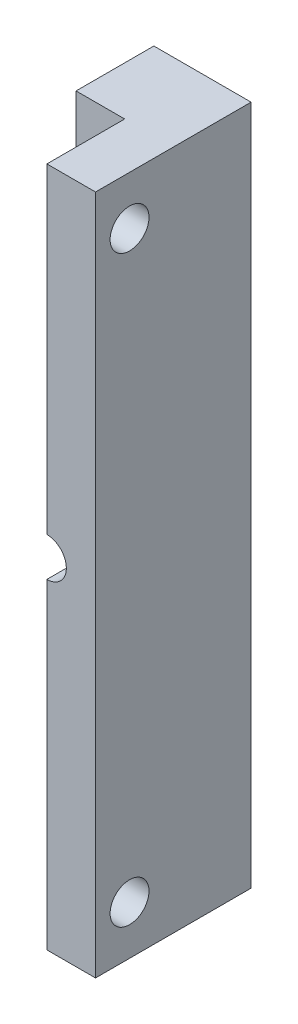
ISO-10303-21;
HEADER;
FILE_DESCRIPTION(('STEP AP214'),'2;1');
FILE_NAME('part.step','',(''),(''),'','','');
FILE_SCHEMA(('AUTOMOTIVE_DESIGN { 1 0 10303 214 1 1 1 1 }'));
ENDSEC;
DATA;
#1=APPLICATION_CONTEXT('core data for automotive mechanical design processes');
#2=APPLICATION_PROTOCOL_DEFINITION('international standard','automotive_design',2000,#1);
#3=PRODUCT_CONTEXT('',#1,'mechanical');
#4=PRODUCT('Part','Part','',(#3));
#5=PRODUCT_RELATED_PRODUCT_CATEGORY('part','',(#4));
#6=PRODUCT_DEFINITION_FORMATION('','',#4);
#7=PRODUCT_DEFINITION_CONTEXT('part definition',#1,'design');
#8=PRODUCT_DEFINITION('design','',#6,#7);
#9=PRODUCT_DEFINITION_SHAPE('','',#8);
#10=(LENGTH_UNIT() NAMED_UNIT(*) SI_UNIT(.MILLI.,.METRE.));
#11=(NAMED_UNIT(*) PLANE_ANGLE_UNIT() SI_UNIT($,.RADIAN.));
#12=(NAMED_UNIT(*) SI_UNIT($,.STERADIAN.) SOLID_ANGLE_UNIT());
#13=UNCERTAINTY_MEASURE_WITH_UNIT(LENGTH_MEASURE(1.E-05),#10,'distance_accuracy_value','');
#14=(GEOMETRIC_REPRESENTATION_CONTEXT(3) GLOBAL_UNCERTAINTY_ASSIGNED_CONTEXT((#13)) GLOBAL_UNIT_ASSIGNED_CONTEXT((#10,
#11,#12)) REPRESENTATION_CONTEXT('',''));
#15=CARTESIAN_POINT('',(0.,0.,0.));
#16=DIRECTION('',(0.,0.,1.));
#17=DIRECTION('',(1.,0.,0.));
#18=AXIS2_PLACEMENT_3D('',#15,#16,#17);
#19=CARTESIAN_POINT('',(0.,70.,0.));
#20=DIRECTION('',(1.,0.,0.));
#21=DIRECTION('',(0.,0.,-1.));
#22=AXIS2_PLACEMENT_3D('',#19,#20,#21);
#23=PLANE('',#22);
#24=CARTESIAN_POINT('',(0.,60.,29.));
#25=DIRECTION('',(1.,0.,0.));
#26=DIRECTION('',(0.,0.,-1.));
#27=AXIS2_PLACEMENT_3D('',#24,#25,#26);
#28=CIRCLE('',#27,4.);
#29=CARTESIAN_POINT('',(0.,60.,25.));
#30=VERTEX_POINT('',#29);
#31=EDGE_CURVE('E72',#30,#30,#28,.F.);
#32=ORIENTED_EDGE('',*,*,#31,.F.);
#33=EDGE_LOOP('',(#32));
#34=FACE_BOUND('',#33,.T.);
#35=DIRECTION('',(0.,-1.,0.));
#36=VECTOR('',#35,1.);
#37=CARTESIAN_POINT('',(0.,70.,20.));
#38=LINE('',#37,#36);
#39=CARTESIAN_POINT('',(0.,70.,20.));
#40=VERTEX_POINT('',#39);
#41=CARTESIAN_POINT('',(0.,4.,20.));
#42=VERTEX_POINT('',#41);
#43=EDGE_CURVE('E332',#40,#42,#38,.T.);
#44=ORIENTED_EDGE('',*,*,#43,.T.);
#45=DIRECTION('',(0.,0.,1.));
#46=VECTOR('',#45,1.);
#47=CARTESIAN_POINT('',(0.,4.,16.));
#48=LINE('',#47,#46);
#49=CARTESIAN_POINT('',(0.,4.,36.));
#50=VERTEX_POINT('',#49);
#51=EDGE_CURVE('E86',#42,#50,#48,.T.);
#52=ORIENTED_EDGE('',*,*,#51,.T.);
#53=DIRECTION('',(0.,-1.,0.));
#54=VECTOR('',#53,1.);
#55=CARTESIAN_POINT('',(0.,70.,36.));
#56=LINE('',#55,#54);
#57=CARTESIAN_POINT('',(0.,70.,36.));
#58=VERTEX_POINT('',#57);
#59=EDGE_CURVE('E337',#58,#50,#56,.T.);
#60=ORIENTED_EDGE('',*,*,#59,.F.);
#61=DIRECTION('',(0.,0.,1.));
#62=VECTOR('',#61,1.);
#63=CARTESIAN_POINT('',(0.,70.,0.));
#64=LINE('',#63,#62);
#65=EDGE_CURVE('E353',#40,#58,#64,.T.);
#66=ORIENTED_EDGE('',*,*,#65,.F.);
#67=EDGE_LOOP('',(#44,#52,#60,#66));
#68=FACE_BOUND('',#67,.T.);
#69=ADVANCED_FACE('F68',(#34,#68),#23,.F.);
#70=CARTESIAN_POINT('',(0.,0.,0.));
#71=DIRECTION('',(0.,0.,1.));
#72=DIRECTION('',(1.,0.,0.));
#73=AXIS2_PLACEMENT_3D('',#70,#71,#72);
#74=PLANE('',#73);
#75=DIRECTION('',(0.,1.,0.));
#76=VECTOR('',#75,1.);
#77=CARTESIAN_POINT('',(-3.1,-22.,0.));
#78=LINE('',#77,#76);
#79=CARTESIAN_POINT('',(-3.1,3.1,0.));
#80=VERTEX_POINT('',#79);
#81=CARTESIAN_POINT('',(-3.1,48.,0.));
#82=VERTEX_POINT('',#81);
#83=EDGE_CURVE('E223',#80,#82,#78,.T.);
#84=ORIENTED_EDGE('',*,*,#83,.T.);
#85=DIRECTION('',(-1.,0.,0.));
#86=VECTOR('',#85,1.);
#87=CARTESIAN_POINT('',(3.1,48.,0.));
#88=LINE('',#87,#86);
#89=CARTESIAN_POINT('',(3.1,48.,0.));
#90=VERTEX_POINT('',#89);
#91=EDGE_CURVE('E190',#90,#82,#88,.T.);
#92=ORIENTED_EDGE('',*,*,#91,.F.);
#93=DIRECTION('',(0.,1.,0.));
#94=VECTOR('',#93,1.);
#95=CARTESIAN_POINT('',(3.1,-22.,0.));
#96=LINE('',#95,#94);
#97=CARTESIAN_POINT('',(3.1,3.1,0.));
#98=VERTEX_POINT('',#97);
#99=EDGE_CURVE('E230',#98,#90,#96,.T.);
#100=ORIENTED_EDGE('',*,*,#99,.F.);
#101=DIRECTION('',(1.,0.,0.));
#102=VECTOR('',#101,1.);
#103=CARTESIAN_POINT('',(-3.1,3.1,0.));
#104=LINE('',#103,#102);
#105=EDGE_CURVE('E271',#80,#98,#104,.T.);
#106=ORIENTED_EDGE('',*,*,#105,.F.);
#107=EDGE_LOOP('',(#84,#92,#100,#106));
#108=FACE_BOUND('',#107,.T.);
#109=ADVANCED_FACE('F397',(#108),#74,.F.);
#110=CARTESIAN_POINT('',(3.1,-22.,0.));
#111=DIRECTION('',(1.,0.,0.));
#112=DIRECTION('',(0.,0.,-1.));
#113=AXIS2_PLACEMENT_3D('',#110,#111,#112);
#114=PLANE('',#113);
#115=DIRECTION('',(0.,0.,-1.));
#116=VECTOR('',#115,1.);
#117=CARTESIAN_POINT('',(3.1,48.,4.));
#118=LINE('',#117,#116);
#119=CARTESIAN_POINT('',(3.1,48.,4.));
#120=VERTEX_POINT('',#119);
#121=EDGE_CURVE('E196',#120,#90,#118,.T.);
#122=ORIENTED_EDGE('',*,*,#121,.F.);
#123=DIRECTION('',(0.,1.,0.));
#124=VECTOR('',#123,1.);
#125=CARTESIAN_POINT('',(3.1,-22.,4.));
#126=LINE('',#125,#124);
#127=CARTESIAN_POINT('',(3.1,3.1,4.));
#128=VERTEX_POINT('',#127);
#129=EDGE_CURVE('E205',#128,#120,#126,.T.);
#130=ORIENTED_EDGE('',*,*,#129,.F.);
#131=DIRECTION('',(0.,0.,-1.));
#132=VECTOR('',#131,1.);
#133=CARTESIAN_POINT('',(3.1,3.1,4.));
#134=LINE('',#133,#132);
#135=EDGE_CURVE('E218',#128,#98,#134,.T.);
#136=ORIENTED_EDGE('',*,*,#135,.T.);
#137=ORIENTED_EDGE('',*,*,#99,.T.);
#138=EDGE_LOOP('',(#122,#130,#136,#137));
#139=FACE_BOUND('',#138,.T.);
#140=ADVANCED_FACE('F448',(#139),#114,.T.);
#141=CARTESIAN_POINT('',(-3.1,-22.,0.));
#142=DIRECTION('',(-1.,0.,0.));
#143=DIRECTION('',(0.,0.,1.));
#144=AXIS2_PLACEMENT_3D('',#141,#142,#143);
#145=PLANE('',#144);
#146=DIRECTION('',(0.,0.,-1.));
#147=VECTOR('',#146,1.);
#148=CARTESIAN_POINT('',(-3.1,48.,4.));
#149=LINE('',#148,#147);
#150=CARTESIAN_POINT('',(-3.1,48.,4.));
#151=VERTEX_POINT('',#150);
#152=EDGE_CURVE('E184',#151,#82,#149,.T.);
#153=ORIENTED_EDGE('',*,*,#152,.T.);
#154=ORIENTED_EDGE('',*,*,#83,.F.);
#155=DIRECTION('',(0.,0.,-1.));
#156=VECTOR('',#155,1.);
#157=CARTESIAN_POINT('',(-3.1,3.1,4.));
#158=LINE('',#157,#156);
#159=CARTESIAN_POINT('',(-3.1,3.1,4.));
#160=VERTEX_POINT('',#159);
#161=EDGE_CURVE('E210',#160,#80,#158,.T.);
#162=ORIENTED_EDGE('',*,*,#161,.F.);
#163=DIRECTION('',(0.,1.,0.));
#164=VECTOR('',#163,1.);
#165=CARTESIAN_POINT('',(-3.1,-22.,4.));
#166=LINE('',#165,#164);
#167=EDGE_CURVE('E78',#160,#151,#166,.T.);
#168=ORIENTED_EDGE('',*,*,#167,.T.);
#169=EDGE_LOOP('',(#153,#154,#162,#168));
#170=FACE_BOUND('',#169,.T.);
#171=ADVANCED_FACE('F209',(#170),#145,.T.);
#172=CARTESIAN_POINT('',(3.1,-48.,0.));
#173=VERTEX_POINT('',#172);
#174=CARTESIAN_POINT('',(3.1,-3.1,0.));
#175=VERTEX_POINT('',#174);
#176=EDGE_CURVE('E228',#173,#175,#96,.T.);
#177=ORIENTED_EDGE('',*,*,#176,.F.);
#178=DIRECTION('',(1.,0.,0.));
#179=VECTOR('',#178,1.);
#180=CARTESIAN_POINT('',(-3.09999999999999,-48.,0.));
#181=LINE('',#180,#179);
#182=CARTESIAN_POINT('',(-3.09999999999999,-48.,0.));
#183=VERTEX_POINT('',#182);
#184=EDGE_CURVE('E373',#183,#173,#181,.T.);
#185=ORIENTED_EDGE('',*,*,#184,.F.);
#186=CARTESIAN_POINT('',(-3.1,-3.1,0.));
#187=VERTEX_POINT('',#186);
#188=EDGE_CURVE('E215',#183,#187,#78,.T.);
#189=ORIENTED_EDGE('',*,*,#188,.T.);
#190=DIRECTION('',(-1.,0.,0.));
#191=VECTOR('',#190,1.);
#192=CARTESIAN_POINT('',(3.1,-3.1,0.));
#193=LINE('',#192,#191);
#194=EDGE_CURVE('E250',#175,#187,#193,.T.);
#195=ORIENTED_EDGE('',*,*,#194,.F.);
#196=EDGE_LOOP('',(#177,#185,#189,#195));
#197=FACE_BOUND('',#196,.T.);
#198=ADVANCED_FACE('F70',(#197),#74,.F.);
#199=DIRECTION('',(0.,0.,-1.));
#200=VECTOR('',#199,1.);
#201=CARTESIAN_POINT('',(3.1,-48.,4.));
#202=LINE('',#201,#200);
#203=CARTESIAN_POINT('',(3.1,-48.,4.));
#204=VERTEX_POINT('',#203);
#205=EDGE_CURVE('E374',#204,#173,#202,.T.);
#206=ORIENTED_EDGE('',*,*,#205,.T.);
#207=ORIENTED_EDGE('',*,*,#176,.T.);
#208=DIRECTION('',(0.,0.,-1.));
#209=VECTOR('',#208,1.);
#210=CARTESIAN_POINT('',(3.1,-3.1,4.));
#211=LINE('',#210,#209);
#212=CARTESIAN_POINT('',(3.1,-3.1,4.));
#213=VERTEX_POINT('',#212);
#214=EDGE_CURVE('E247',#213,#175,#211,.T.);
#215=ORIENTED_EDGE('',*,*,#214,.F.);
#216=EDGE_CURVE('E231',#204,#213,#126,.T.);
#217=ORIENTED_EDGE('',*,*,#216,.F.);
#218=EDGE_LOOP('',(#206,#207,#215,#217));
#219=FACE_BOUND('',#218,.T.);
#220=ADVANCED_FACE('F442',(#219),#114,.T.);
#221=DIRECTION('',(0.,0.,-1.));
#222=VECTOR('',#221,1.);
#223=CARTESIAN_POINT('',(-3.09999999999999,-48.,4.));
#224=LINE('',#223,#222);
#225=CARTESIAN_POINT('',(-3.09999999999999,-48.,4.));
#226=VERTEX_POINT('',#225);
#227=EDGE_CURVE('E377',#226,#183,#224,.T.);
#228=ORIENTED_EDGE('',*,*,#227,.F.);
#229=CARTESIAN_POINT('',(-3.1,-3.1,4.));
#230=VERTEX_POINT('',#229);
#231=EDGE_CURVE('E12',#226,#230,#166,.T.);
#232=ORIENTED_EDGE('',*,*,#231,.T.);
#233=DIRECTION('',(0.,0.,-1.));
#234=VECTOR('',#233,1.);
#235=CARTESIAN_POINT('',(-3.1,-3.1,4.));
#236=LINE('',#235,#234);
#237=EDGE_CURVE('E241',#230,#187,#236,.T.);
#238=ORIENTED_EDGE('',*,*,#237,.T.);
#239=ORIENTED_EDGE('',*,*,#188,.F.);
#240=EDGE_LOOP('',(#228,#232,#238,#239));
#241=FACE_BOUND('',#240,.T.);
#242=ADVANCED_FACE('F432',(#241),#145,.T.);
#243=CARTESIAN_POINT('',(0.,-22.,4.));
#244=DIRECTION('',(0.,0.,-1.));
#245=DIRECTION('',(-1.,0.,0.));
#246=AXIS2_PLACEMENT_3D('',#243,#244,#245);
#247=PLANE('',#246);
#248=ORIENTED_EDGE('',*,*,#129,.T.);
#249=DIRECTION('',(-1.,0.,0.));
#250=VECTOR('',#249,1.);
#251=CARTESIAN_POINT('',(3.1,48.,4.));
#252=LINE('',#251,#250);
#253=EDGE_CURVE('E187',#120,#151,#252,.T.);
#254=ORIENTED_EDGE('',*,*,#253,.T.);
#255=ORIENTED_EDGE('',*,*,#167,.F.);
#256=DIRECTION('',(1.,0.,0.));
#257=VECTOR('',#256,1.);
#258=CARTESIAN_POINT('',(-3.1,3.1,4.));
#259=LINE('',#258,#257);
#260=EDGE_CURVE('E264',#160,#128,#259,.T.);
#261=ORIENTED_EDGE('',*,*,#260,.T.);
#262=EDGE_LOOP('',(#248,#254,#255,#261));
#263=FACE_BOUND('',#262,.T.);
#264=ORIENTED_EDGE('',*,*,#231,.F.);
#265=DIRECTION('',(1.,0.,0.));
#266=VECTOR('',#265,1.);
#267=CARTESIAN_POINT('',(-3.09999999999999,-48.,4.));
#268=LINE('',#267,#266);
#269=EDGE_CURVE('E370',#226,#204,#268,.T.);
#270=ORIENTED_EDGE('',*,*,#269,.T.);
#271=ORIENTED_EDGE('',*,*,#216,.T.);
#272=DIRECTION('',(-1.,0.,0.));
#273=VECTOR('',#272,1.);
#274=CARTESIAN_POINT('',(3.1,-3.1,4.));
#275=LINE('',#274,#273);
#276=EDGE_CURVE('E260',#213,#230,#275,.T.);
#277=ORIENTED_EDGE('',*,*,#276,.T.);
#278=EDGE_LOOP('',(#264,#270,#271,#277));
#279=FACE_BOUND('',#278,.T.);
#280=CARTESIAN_POINT('',(0.,0.,4.));
#281=DIRECTION('',(0.,0.,1.));
#282=DIRECTION('',(1.,0.,0.));
#283=AXIS2_PLACEMENT_3D('',#280,#281,#282);
#284=CIRCLE('',#283,2.6);
#285=CARTESIAN_POINT('',(2.6,0.,4.));
#286=VERTEX_POINT('',#285);
#287=EDGE_CURVE('E277',#286,#286,#284,.T.);
#288=ORIENTED_EDGE('',*,*,#287,.T.);
#289=EDGE_LOOP('',(#288));
#290=FACE_BOUND('',#289,.T.);
#291=DIRECTION('',(0.,1.,0.));
#292=VECTOR('',#291,1.);
#293=CARTESIAN_POINT('',(-10.,-22.,4.));
#294=LINE('',#293,#292);
#295=CARTESIAN_POINT('',(-10.,-70.,4.));
#296=VERTEX_POINT('',#295);
#297=CARTESIAN_POINT('',(-10.,70.,4.));
#298=VERTEX_POINT('',#297);
#299=EDGE_CURVE('E212',#296,#298,#294,.T.);
#300=ORIENTED_EDGE('',*,*,#299,.T.);
#301=DIRECTION('',(1.,0.,0.));
#302=VECTOR('',#301,1.);
#303=CARTESIAN_POINT('',(-10.,70.,4.));
#304=LINE('',#303,#302);
#305=CARTESIAN_POINT('',(10.,70.,4.));
#306=VERTEX_POINT('',#305);
#307=EDGE_CURVE('E295',#298,#306,#304,.T.);
#308=ORIENTED_EDGE('',*,*,#307,.T.);
#309=DIRECTION('',(0.,1.,0.));
#310=VECTOR('',#309,1.);
#311=CARTESIAN_POINT('',(10.,-22.,4.));
#312=LINE('',#311,#310);
#313=CARTESIAN_POINT('',(10.,-70.,4.));
#314=VERTEX_POINT('',#313);
#315=EDGE_CURVE('E224',#314,#306,#312,.T.);
#316=ORIENTED_EDGE('',*,*,#315,.F.);
#317=DIRECTION('',(-1.,0.,0.));
#318=VECTOR('',#317,1.);
#319=CARTESIAN_POINT('',(-3.09999999999999,-70.,4.));
#320=LINE('',#319,#318);
#321=EDGE_CURVE('E306',#314,#296,#320,.T.);
#322=ORIENTED_EDGE('',*,*,#321,.T.);
#323=EDGE_LOOP('',(#300,#308,#316,#322));
#324=FACE_BOUND('',#323,.T.);
#325=ADVANCED_FACE('F201',(#263,#279,#290,#324),#247,.T.);
#326=CARTESIAN_POINT('',(-3.1,3.1,4.));
#327=DIRECTION('',(0.,1.,0.));
#328=DIRECTION('',(0.,0.,1.));
#329=AXIS2_PLACEMENT_3D('',#326,#327,#328);
#330=PLANE('',#329);
#331=ORIENTED_EDGE('',*,*,#105,.T.);
#332=ORIENTED_EDGE('',*,*,#135,.F.);
#333=ORIENTED_EDGE('',*,*,#260,.F.);
#334=ORIENTED_EDGE('',*,*,#161,.T.);
#335=EDGE_LOOP('',(#331,#332,#333,#334));
#336=FACE_BOUND('',#335,.T.);
#337=ADVANCED_FACE('F431',(#336),#330,.F.);
#338=CARTESIAN_POINT('',(3.1,-3.1,4.));
#339=DIRECTION('',(0.,-1.,0.));
#340=DIRECTION('',(1.,0.,0.));
#341=AXIS2_PLACEMENT_3D('',#338,#339,#340);
#342=PLANE('',#341);
#343=ORIENTED_EDGE('',*,*,#194,.T.);
#344=ORIENTED_EDGE('',*,*,#237,.F.);
#345=ORIENTED_EDGE('',*,*,#276,.F.);
#346=ORIENTED_EDGE('',*,*,#214,.T.);
#347=EDGE_LOOP('',(#343,#344,#345,#346));
#348=FACE_BOUND('',#347,.T.);
#349=ADVANCED_FACE('F439',(#348),#342,.F.);
#350=CARTESIAN_POINT('',(0.,0.,9.));
#351=DIRECTION('',(0.,0.,1.));
#352=DIRECTION('',(1.,0.,0.));
#353=AXIS2_PLACEMENT_3D('',#350,#351,#352);
#354=CYLINDRICAL_SURFACE('',#353,4.);
#355=CARTESIAN_POINT('',(0.,0.,20.));
#356=DIRECTION('',(0.,0.,1.));
#357=DIRECTION('',(1.,0.,0.));
#358=AXIS2_PLACEMENT_3D('',#355,#356,#357);
#359=CIRCLE('',#358,4.);
#360=CARTESIAN_POINT('',(0.,-4.00000000000001,20.));
#361=VERTEX_POINT('',#360);
#362=EDGE_CURVE('E352',#42,#361,#359,.T.);
#363=ORIENTED_EDGE('',*,*,#362,.T.);
#364=DIRECTION('',(0.,0.,1.));
#365=VECTOR('',#364,1.);
#366=CARTESIAN_POINT('',(0.,-4.00000000000001,16.));
#367=LINE('',#366,#365);
#368=CARTESIAN_POINT('',(0.,-4.00000000000001,36.));
#369=VERTEX_POINT('',#368);
#370=EDGE_CURVE('E364',#369,#361,#367,.F.);
#371=ORIENTED_EDGE('',*,*,#370,.F.);
#372=CARTESIAN_POINT('',(0.,0.,36.));
#373=DIRECTION('',(0.,0.,1.));
#374=DIRECTION('',(1.,0.,0.));
#375=AXIS2_PLACEMENT_3D('',#372,#373,#374);
#376=CIRCLE('',#375,4.);
#377=EDGE_CURVE('E367',#369,#50,#376,.T.);
#378=ORIENTED_EDGE('',*,*,#377,.T.);
#379=ORIENTED_EDGE('',*,*,#51,.F.);
#380=EDGE_LOOP('',(#363,#371,#378,#379));
#381=FACE_BOUND('',#380,.T.);
#382=CARTESIAN_POINT('',(0.,0.,9.));
#383=DIRECTION('',(0.,0.,1.));
#384=DIRECTION('',(1.,0.,0.));
#385=AXIS2_PLACEMENT_3D('',#382,#383,#384);
#386=CIRCLE('',#385,4.);
#387=CARTESIAN_POINT('',(4.,0.,9.));
#388=VERTEX_POINT('',#387);
#389=EDGE_CURVE('E273',#388,#388,#386,.T.);
#390=ORIENTED_EDGE('',*,*,#389,.F.);
#391=EDGE_LOOP('',(#390));
#392=FACE_BOUND('',#391,.T.);
#393=ADVANCED_FACE('F405',(#381,#392),#354,.F.);
#394=CARTESIAN_POINT('',(0.,0.,9.));
#395=DIRECTION('',(0.,0.,1.));
#396=DIRECTION('',(1.,0.,0.));
#397=AXIS2_PLACEMENT_3D('',#394,#395,#396);
#398=PLANE('',#397);
#399=CARTESIAN_POINT('',(0.,0.,9.));
#400=DIRECTION('',(0.,0.,1.));
#401=DIRECTION('',(1.,0.,0.));
#402=AXIS2_PLACEMENT_3D('',#399,#400,#401);
#403=CIRCLE('',#402,2.6);
#404=CARTESIAN_POINT('',(2.6,0.,9.));
#405=VERTEX_POINT('',#404);
#406=EDGE_CURVE('E282',#405,#405,#403,.T.);
#407=ORIENTED_EDGE('',*,*,#406,.F.);
#408=EDGE_LOOP('',(#407));
#409=FACE_BOUND('',#408,.T.);
#410=ORIENTED_EDGE('',*,*,#389,.T.);
#411=EDGE_LOOP('',(#410));
#412=FACE_BOUND('',#411,.T.);
#413=ADVANCED_FACE('F500',(#409,#412),#398,.T.);
#414=CARTESIAN_POINT('',(0.,0.,4.));
#415=DIRECTION('',(0.,0.,1.));
#416=DIRECTION('',(1.,0.,0.));
#417=AXIS2_PLACEMENT_3D('',#414,#415,#416);
#418=CYLINDRICAL_SURFACE('',#417,2.6);
#419=ORIENTED_EDGE('',*,*,#287,.F.);
#420=EDGE_LOOP('',(#419));
#421=FACE_BOUND('',#420,.T.);
#422=ORIENTED_EDGE('',*,*,#406,.T.);
#423=EDGE_LOOP('',(#422));
#424=FACE_BOUND('',#423,.T.);
#425=ADVANCED_FACE('F531',(#421,#424),#418,.F.);
#426=CARTESIAN_POINT('',(-10.,22.,14.));
#427=DIRECTION('',(1.,0.,0.));
#428=DIRECTION('',(0.,0.,-1.));
#429=AXIS2_PLACEMENT_3D('',#426,#427,#428);
#430=PLANE('',#429);
#431=DIRECTION('',(0.,0.,1.));
#432=VECTOR('',#431,1.);
#433=CARTESIAN_POINT('',(-10.,-70.,4.));
#434=LINE('',#433,#432);
#435=CARTESIAN_POINT('',(-9.99999999999999,-70.,20.));
#436=VERTEX_POINT('',#435);
#437=EDGE_CURVE('E302',#296,#436,#434,.T.);
#438=ORIENTED_EDGE('',*,*,#437,.T.);
#439=DIRECTION('',(0.,-1.,0.));
#440=VECTOR('',#439,1.);
#441=CARTESIAN_POINT('',(-9.99999999999999,70.,20.));
#442=LINE('',#441,#440);
#443=CARTESIAN_POINT('',(-9.99999999999999,70.,20.));
#444=VERTEX_POINT('',#443);
#445=EDGE_CURVE('E341',#444,#436,#442,.T.);
#446=ORIENTED_EDGE('',*,*,#445,.F.);
#447=DIRECTION('',(0.,0.,-1.));
#448=VECTOR('',#447,1.);
#449=CARTESIAN_POINT('',(-10.,70.,14.));
#450=LINE('',#449,#448);
#451=EDGE_CURVE('E287',#444,#298,#450,.T.);
#452=ORIENTED_EDGE('',*,*,#451,.T.);
#453=ORIENTED_EDGE('',*,*,#299,.F.);
#454=EDGE_LOOP('',(#438,#446,#452,#453));
#455=FACE_BOUND('',#454,.T.);
#456=ADVANCED_FACE('F427',(#455),#430,.F.);
#457=CARTESIAN_POINT('',(10.,22.,14.));
#458=DIRECTION('',(1.,0.,0.));
#459=DIRECTION('',(0.,0.,-1.));
#460=AXIS2_PLACEMENT_3D('',#457,#458,#459);
#461=PLANE('',#460);
#462=CARTESIAN_POINT('',(10.,60.,29.));
#463=DIRECTION('',(1.,0.,0.));
#464=DIRECTION('',(0.,0.,-1.));
#465=AXIS2_PLACEMENT_3D('',#462,#463,#464);
#466=CIRCLE('',#465,4.);
#467=CARTESIAN_POINT('',(10.,60.,25.));
#468=VERTEX_POINT('',#467);
#469=EDGE_CURVE('E320',#468,#468,#466,.T.);
#470=ORIENTED_EDGE('',*,*,#469,.F.);
#471=EDGE_LOOP('',(#470));
#472=FACE_BOUND('',#471,.T.);
#473=CARTESIAN_POINT('',(10.,-60.,29.));
#474=DIRECTION('',(1.,0.,0.));
#475=DIRECTION('',(0.,0.,-1.));
#476=AXIS2_PLACEMENT_3D('',#473,#474,#475);
#477=CIRCLE('',#476,4.);
#478=CARTESIAN_POINT('',(10.,-60.,25.));
#479=VERTEX_POINT('',#478);
#480=EDGE_CURVE('E321',#479,#479,#477,.T.);
#481=ORIENTED_EDGE('',*,*,#480,.F.);
#482=EDGE_LOOP('',(#481));
#483=FACE_BOUND('',#482,.T.);
#484=ORIENTED_EDGE('',*,*,#315,.T.);
#485=DIRECTION('',(0.,0.,1.));
#486=VECTOR('',#485,1.);
#487=CARTESIAN_POINT('',(10.,70.,4.));
#488=LINE('',#487,#486);
#489=CARTESIAN_POINT('',(10.,70.,36.));
#490=VERTEX_POINT('',#489);
#491=EDGE_CURVE('E291',#306,#490,#488,.T.);
#492=ORIENTED_EDGE('',*,*,#491,.T.);
#493=DIRECTION('',(0.,-1.,0.));
#494=VECTOR('',#493,1.);
#495=CARTESIAN_POINT('',(10.,70.,36.));
#496=LINE('',#495,#494);
#497=CARTESIAN_POINT('',(10.,-70.,36.));
#498=VERTEX_POINT('',#497);
#499=EDGE_CURVE('E316',#490,#498,#496,.T.);
#500=ORIENTED_EDGE('',*,*,#499,.T.);
#501=DIRECTION('',(0.,0.,-1.));
#502=VECTOR('',#501,1.);
#503=CARTESIAN_POINT('',(10.,-70.,14.));
#504=LINE('',#503,#502);
#505=EDGE_CURVE('E298',#498,#314,#504,.T.);
#506=ORIENTED_EDGE('',*,*,#505,.T.);
#507=EDGE_LOOP('',(#484,#492,#500,#506));
#508=FACE_BOUND('',#507,.T.);
#509=ADVANCED_FACE('F419',(#472,#483,#508),#461,.T.);
#510=CARTESIAN_POINT('',(0.,70.,0.));
#511=DIRECTION('',(0.,1.,0.));
#512=DIRECTION('',(0.,0.,1.));
#513=AXIS2_PLACEMENT_3D('',#510,#511,#512);
#514=PLANE('',#513);
#515=ORIENTED_EDGE('',*,*,#491,.F.);
#516=ORIENTED_EDGE('',*,*,#307,.F.);
#517=ORIENTED_EDGE('',*,*,#451,.F.);
#518=DIRECTION('',(1.,0.,0.));
#519=VECTOR('',#518,1.);
#520=CARTESIAN_POINT('',(0.,70.,20.));
#521=LINE('',#520,#519);
#522=EDGE_CURVE('E347',#444,#40,#521,.T.);
#523=ORIENTED_EDGE('',*,*,#522,.T.);
#524=ORIENTED_EDGE('',*,*,#65,.T.);
#525=DIRECTION('',(1.,0.,0.));
#526=VECTOR('',#525,1.);
#527=CARTESIAN_POINT('',(-9.99999999999999,70.,36.));
#528=LINE('',#527,#526);
#529=EDGE_CURVE('E313',#58,#490,#528,.T.);
#530=ORIENTED_EDGE('',*,*,#529,.T.);
#531=EDGE_LOOP('',(#515,#516,#517,#523,#524,#530));
#532=FACE_BOUND('',#531,.T.);
#533=ADVANCED_FACE('F424',(#532),#514,.T.);
#534=CARTESIAN_POINT('',(0.,-70.,0.));
#535=DIRECTION('',(0.,1.,0.));
#536=DIRECTION('',(0.,0.,1.));
#537=AXIS2_PLACEMENT_3D('',#534,#535,#536);
#538=PLANE('',#537);
#539=ORIENTED_EDGE('',*,*,#321,.F.);
#540=ORIENTED_EDGE('',*,*,#505,.F.);
#541=DIRECTION('',(1.,0.,0.));
#542=VECTOR('',#541,1.);
#543=CARTESIAN_POINT('',(-9.99999999999999,-70.,36.));
#544=LINE('',#543,#542);
#545=CARTESIAN_POINT('',(0.,-70.,36.));
#546=VERTEX_POINT('',#545);
#547=EDGE_CURVE('E310',#546,#498,#544,.T.);
#548=ORIENTED_EDGE('',*,*,#547,.F.);
#549=DIRECTION('',(0.,0.,1.));
#550=VECTOR('',#549,1.);
#551=CARTESIAN_POINT('',(0.,-70.,0.));
#552=LINE('',#551,#550);
#553=CARTESIAN_POINT('',(0.,-70.,20.));
#554=VERTEX_POINT('',#553);
#555=EDGE_CURVE('E344',#554,#546,#552,.T.);
#556=ORIENTED_EDGE('',*,*,#555,.F.);
#557=DIRECTION('',(1.,0.,0.));
#558=VECTOR('',#557,1.);
#559=CARTESIAN_POINT('',(0.,-70.,20.));
#560=LINE('',#559,#558);
#561=EDGE_CURVE('E348',#436,#554,#560,.T.);
#562=ORIENTED_EDGE('',*,*,#561,.F.);
#563=ORIENTED_EDGE('',*,*,#437,.F.);
#564=EDGE_LOOP('',(#539,#540,#548,#556,#562,#563));
#565=FACE_BOUND('',#564,.T.);
#566=ADVANCED_FACE('F416',(#565),#538,.F.);
#567=CARTESIAN_POINT('',(-9.99999999999999,70.,36.));
#568=DIRECTION('',(0.,0.,1.));
#569=DIRECTION('',(1.,0.,0.));
#570=AXIS2_PLACEMENT_3D('',#567,#568,#569);
#571=PLANE('',#570);
#572=ORIENTED_EDGE('',*,*,#377,.F.);
#573=EDGE_CURVE('E94',#369,#546,#56,.T.);
#574=ORIENTED_EDGE('',*,*,#573,.T.);
#575=ORIENTED_EDGE('',*,*,#547,.T.);
#576=ORIENTED_EDGE('',*,*,#499,.F.);
#577=ORIENTED_EDGE('',*,*,#529,.F.);
#578=ORIENTED_EDGE('',*,*,#59,.T.);
#579=EDGE_LOOP('',(#572,#574,#575,#576,#577,#578));
#580=FACE_BOUND('',#579,.T.);
#581=ADVANCED_FACE('F408',(#580),#571,.T.);
#582=CARTESIAN_POINT('',(-10.,-60.,29.));
#583=DIRECTION('',(1.,0.,0.));
#584=DIRECTION('',(0.,0.,-1.));
#585=AXIS2_PLACEMENT_3D('',#582,#583,#584);
#586=CYLINDRICAL_SURFACE('',#585,4.);
#587=CARTESIAN_POINT('',(0.,-60.,29.));
#588=DIRECTION('',(1.,0.,0.));
#589=DIRECTION('',(0.,0.,-1.));
#590=AXIS2_PLACEMENT_3D('',#587,#588,#589);
#591=CIRCLE('',#590,4.);
#592=CARTESIAN_POINT('',(0.,-60.,25.));
#593=VERTEX_POINT('',#592);
#594=EDGE_CURVE('E325',#593,#593,#591,.F.);
#595=ORIENTED_EDGE('',*,*,#594,.T.);
#596=EDGE_LOOP('',(#595));
#597=FACE_BOUND('',#596,.T.);
#598=ORIENTED_EDGE('',*,*,#480,.T.);
#599=EDGE_LOOP('',(#598));
#600=FACE_BOUND('',#599,.T.);
#601=ADVANCED_FACE('F487',(#597,#600),#586,.F.);
#602=CARTESIAN_POINT('',(-10.,60.,29.));
#603=DIRECTION('',(1.,0.,0.));
#604=DIRECTION('',(0.,0.,-1.));
#605=AXIS2_PLACEMENT_3D('',#602,#603,#604);
#606=CYLINDRICAL_SURFACE('',#605,4.);
#607=ORIENTED_EDGE('',*,*,#31,.T.);
#608=EDGE_LOOP('',(#607));
#609=FACE_BOUND('',#608,.T.);
#610=ORIENTED_EDGE('',*,*,#469,.T.);
#611=EDGE_LOOP('',(#610));
#612=FACE_BOUND('',#611,.T.);
#613=ADVANCED_FACE('F392',(#609,#612),#606,.F.);
#614=ORIENTED_EDGE('',*,*,#573,.F.);
#615=ORIENTED_EDGE('',*,*,#370,.T.);
#616=EDGE_CURVE('E336',#361,#554,#38,.T.);
#617=ORIENTED_EDGE('',*,*,#616,.T.);
#618=ORIENTED_EDGE('',*,*,#555,.T.);
#619=EDGE_LOOP('',(#614,#615,#617,#618));
#620=FACE_BOUND('',#619,.T.);
#621=ORIENTED_EDGE('',*,*,#594,.F.);
#622=EDGE_LOOP('',(#621));
#623=FACE_BOUND('',#622,.T.);
#624=ADVANCED_FACE('F399',(#620,#623),#23,.F.);
#625=CARTESIAN_POINT('',(0.,70.,20.));
#626=DIRECTION('',(0.,0.,-1.));
#627=DIRECTION('',(-1.,0.,0.));
#628=AXIS2_PLACEMENT_3D('',#625,#626,#627);
#629=PLANE('',#628);
#630=ORIENTED_EDGE('',*,*,#616,.F.);
#631=ORIENTED_EDGE('',*,*,#362,.F.);
#632=ORIENTED_EDGE('',*,*,#43,.F.);
#633=ORIENTED_EDGE('',*,*,#522,.F.);
#634=ORIENTED_EDGE('',*,*,#445,.T.);
#635=ORIENTED_EDGE('',*,*,#561,.T.);
#636=EDGE_LOOP('',(#630,#631,#632,#633,#634,#635));
#637=FACE_BOUND('',#636,.T.);
#638=ADVANCED_FACE('F403',(#637),#629,.F.);
#639=CARTESIAN_POINT('',(-3.09999999999999,-48.,4.));
#640=DIRECTION('',(0.,1.,0.));
#641=DIRECTION('',(0.,0.,1.));
#642=AXIS2_PLACEMENT_3D('',#639,#640,#641);
#643=PLANE('',#642);
#644=ORIENTED_EDGE('',*,*,#184,.T.);
#645=ORIENTED_EDGE('',*,*,#205,.F.);
#646=ORIENTED_EDGE('',*,*,#269,.F.);
#647=ORIENTED_EDGE('',*,*,#227,.T.);
#648=EDGE_LOOP('',(#644,#645,#646,#647));
#649=FACE_BOUND('',#648,.T.);
#650=ADVANCED_FACE('F468',(#649),#643,.F.);
#651=CARTESIAN_POINT('',(3.1,48.,4.));
#652=DIRECTION('',(0.,-1.,0.));
#653=DIRECTION('',(0.,0.,-1.));
#654=AXIS2_PLACEMENT_3D('',#651,#652,#653);
#655=PLANE('',#654);
#656=ORIENTED_EDGE('',*,*,#91,.T.);
#657=ORIENTED_EDGE('',*,*,#152,.F.);
#658=ORIENTED_EDGE('',*,*,#253,.F.);
#659=ORIENTED_EDGE('',*,*,#121,.T.);
#660=EDGE_LOOP('',(#656,#657,#658,#659));
#661=FACE_BOUND('',#660,.T.);
#662=ADVANCED_FACE('F186',(#661),#655,.F.);
#663=CLOSED_SHELL('',(#69,#109,#140,#171,#198,#220,#242,#325,#337,#349,#393,#413,#425,#456,#509,
#533,#566,#581,#601,#613,#624,#638,#650,#662));
#664=MANIFOLD_SOLID_BREP('B2',#663);
#665=ADVANCED_BREP_SHAPE_REPRESENTATION('',(#18,#664),#14);
#666=SHAPE_DEFINITION_REPRESENTATION(#9,#665);
ENDSEC;
END-ISO-10303-21;
